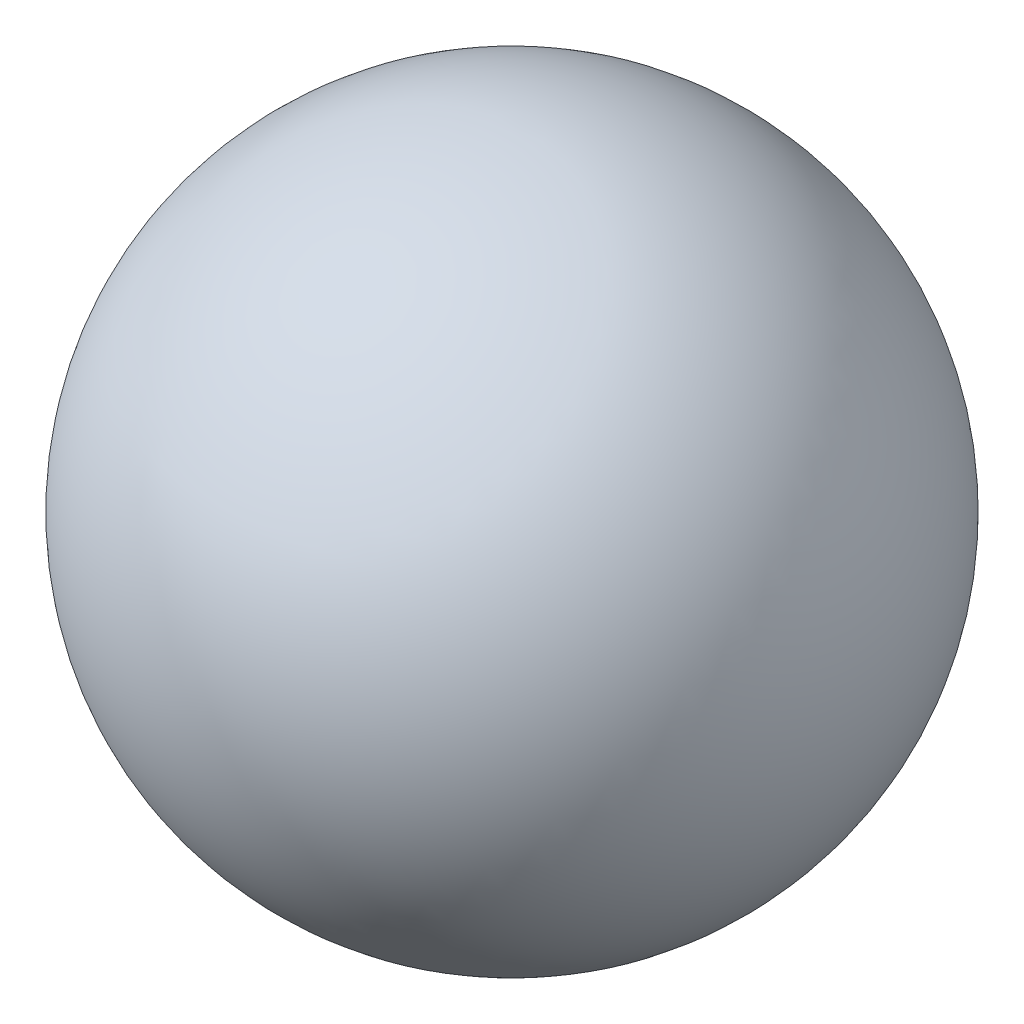
ISO-10303-21;
HEADER;
FILE_DESCRIPTION(('STEP AP214'),'2;1');
FILE_NAME('part.step','',(''),(''),'','','');
FILE_SCHEMA(('AUTOMOTIVE_DESIGN { 1 0 10303 214 1 1 1 1 }'));
ENDSEC;
DATA;
#1=APPLICATION_CONTEXT('core data for automotive mechanical design processes');
#2=APPLICATION_PROTOCOL_DEFINITION('international standard','automotive_design',2000,#1);
#3=PRODUCT_CONTEXT('',#1,'mechanical');
#4=PRODUCT('Part','Part','',(#3));
#5=PRODUCT_RELATED_PRODUCT_CATEGORY('part','',(#4));
#6=PRODUCT_DEFINITION_FORMATION('','',#4);
#7=PRODUCT_DEFINITION_CONTEXT('part definition',#1,'design');
#8=PRODUCT_DEFINITION('design','',#6,#7);
#9=PRODUCT_DEFINITION_SHAPE('','',#8);
#10=(LENGTH_UNIT() NAMED_UNIT(*) SI_UNIT(.MILLI.,.METRE.));
#11=(NAMED_UNIT(*) PLANE_ANGLE_UNIT() SI_UNIT($,.RADIAN.));
#12=(NAMED_UNIT(*) SI_UNIT($,.STERADIAN.) SOLID_ANGLE_UNIT());
#13=UNCERTAINTY_MEASURE_WITH_UNIT(LENGTH_MEASURE(1.E-05),#10,'distance_accuracy_value','');
#14=(GEOMETRIC_REPRESENTATION_CONTEXT(3) GLOBAL_UNCERTAINTY_ASSIGNED_CONTEXT((#13)) GLOBAL_UNIT_ASSIGNED_CONTEXT((#10,
#11,#12)) REPRESENTATION_CONTEXT('',''));
#15=CARTESIAN_POINT('',(0.,0.,0.));
#16=DIRECTION('',(0.,0.,1.));
#17=DIRECTION('',(1.,0.,0.));
#18=AXIS2_PLACEMENT_3D('',#15,#16,#17);
#19=CARTESIAN_POINT('',(0.,0.,0.));
#20=DIRECTION('',(0.,-1.,0.));
#21=DIRECTION('',(-1.,0.,0.));
#22=AXIS2_PLACEMENT_3D('',#19,#20,#21);
#23=SPHERICAL_SURFACE('',#22,21.);
#24=CARTESIAN_POINT('',(0.,-21.,0.));
#25=VERTEX_POINT('',#24);
#26=VERTEX_LOOP('',#25);
#27=FACE_BOUND('',#26,.T.);
#28=ADVANCED_FACE('F35',(#27),#23,.T.);
#29=CLOSED_SHELL('',(#28));
#30=MANIFOLD_SOLID_BREP('B2',#29);
#31=ADVANCED_BREP_SHAPE_REPRESENTATION('',(#18,#30),#14);
#32=SHAPE_DEFINITION_REPRESENTATION(#9,#31);
ENDSEC;
END-ISO-10303-21;
